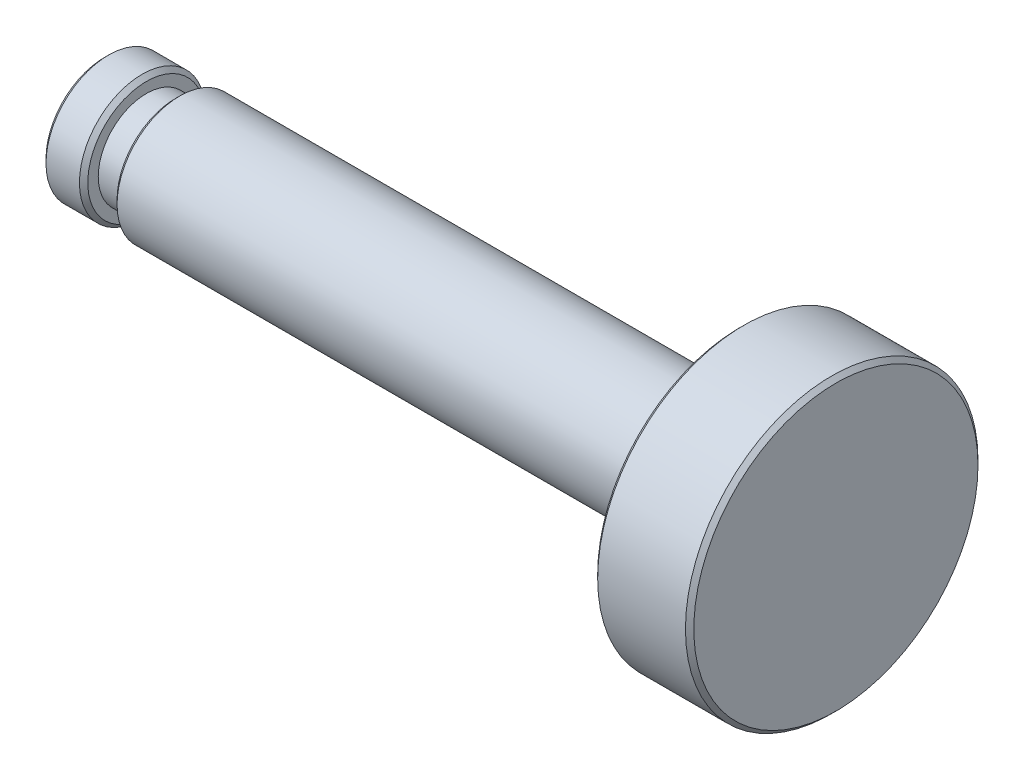
ISO-10303-21;
HEADER;
FILE_DESCRIPTION(('STEP AP214'),'2;1');
FILE_NAME('part.step','',(''),(''),'','','');
FILE_SCHEMA(('AUTOMOTIVE_DESIGN { 1 0 10303 214 1 1 1 1 }'));
ENDSEC;
DATA;
#1=APPLICATION_CONTEXT('core data for automotive mechanical design processes');
#2=APPLICATION_PROTOCOL_DEFINITION('international standard','automotive_design',2000,#1);
#3=PRODUCT_CONTEXT('',#1,'mechanical');
#4=PRODUCT('Part','Part','',(#3));
#5=PRODUCT_RELATED_PRODUCT_CATEGORY('part','',(#4));
#6=PRODUCT_DEFINITION_FORMATION('','',#4);
#7=PRODUCT_DEFINITION_CONTEXT('part definition',#1,'design');
#8=PRODUCT_DEFINITION('design','',#6,#7);
#9=PRODUCT_DEFINITION_SHAPE('','',#8);
#10=(LENGTH_UNIT() NAMED_UNIT(*) SI_UNIT(.MILLI.,.METRE.));
#11=(NAMED_UNIT(*) PLANE_ANGLE_UNIT() SI_UNIT($,.RADIAN.));
#12=(NAMED_UNIT(*) SI_UNIT($,.STERADIAN.) SOLID_ANGLE_UNIT());
#13=UNCERTAINTY_MEASURE_WITH_UNIT(LENGTH_MEASURE(1.E-05),#10,'distance_accuracy_value','');
#14=(GEOMETRIC_REPRESENTATION_CONTEXT(3) GLOBAL_UNCERTAINTY_ASSIGNED_CONTEXT((#13)) GLOBAL_UNIT_ASSIGNED_CONTEXT((#10,
#11,#12)) REPRESENTATION_CONTEXT('',''));
#15=CARTESIAN_POINT('',(0.,0.,0.));
#16=DIRECTION('',(0.,0.,1.));
#17=DIRECTION('',(1.,0.,0.));
#18=AXIS2_PLACEMENT_3D('',#15,#16,#17);
#19=CARTESIAN_POINT('',(-8.75,1.5,0.));
#20=DIRECTION('',(-1.,0.,0.));
#21=DIRECTION('',(0.,0.,1.));
#22=AXIS2_PLACEMENT_3D('',#19,#20,#21);
#23=PLANE('',#22);
#24=CARTESIAN_POINT('',(-8.74999999996362,0.,0.));
#25=DIRECTION('',(1.,0.,0.));
#26=DIRECTION('',(0.,0.,-1.));
#27=AXIS2_PLACEMENT_3D('',#24,#25,#26);
#28=CIRCLE('',#27,1.40000000004648);
#29=CARTESIAN_POINT('',(-8.74999999996362,0.,1.40000000004648));
#30=VERTEX_POINT('',#29);
#31=EDGE_CURVE('E11',#30,#30,#28,.T.);
#32=ORIENTED_EDGE('',*,*,#31,.F.);
#33=EDGE_LOOP('',(#32));
#34=FACE_BOUND('',#33,.T.);
#35=ADVANCED_FACE('F17',(#34),#23,.T.);
#36=CARTESIAN_POINT('',(8.75,3.5,0.));
#37=DIRECTION('',(1.,0.,0.));
#38=DIRECTION('',(0.,1.,0.));
#39=AXIS2_PLACEMENT_3D('',#36,#37,#38);
#40=PLANE('',#39);
#41=CARTESIAN_POINT('',(8.74999999996362,0.,0.));
#42=DIRECTION('',(-1.,0.,0.));
#43=DIRECTION('',(0.,0.,1.));
#44=AXIS2_PLACEMENT_3D('',#41,#42,#43);
#45=CIRCLE('',#44,3.40000000005602);
#46=CARTESIAN_POINT('',(8.74999999996362,0.,-3.40000000005602));
#47=VERTEX_POINT('',#46);
#48=EDGE_CURVE('E88',#47,#47,#45,.T.);
#49=ORIENTED_EDGE('',*,*,#48,.F.);
#50=EDGE_LOOP('',(#49));
#51=FACE_BOUND('',#50,.T.);
#52=ADVANCED_FACE('F384',(#51),#40,.T.);
#53=CARTESIAN_POINT('',(-7.75,1.15,0.));
#54=DIRECTION('',(1.,0.,0.));
#55=DIRECTION('',(0.,1.,0.));
#56=AXIS2_PLACEMENT_3D('',#53,#54,#55);
#57=PLANE('',#56);
#58=CARTESIAN_POINT('',(-7.75,0.,0.));
#59=DIRECTION('',(1.,0.,0.));
#60=DIRECTION('',(0.,0.,-1.));
#61=AXIS2_PLACEMENT_3D('',#58,#59,#60);
#62=CIRCLE('',#61,1.15);
#63=CARTESIAN_POINT('',(-7.75,0.,1.15));
#64=VERTEX_POINT('',#63);
#65=EDGE_CURVE('E139',#64,#64,#62,.T.);
#66=ORIENTED_EDGE('',*,*,#65,.F.);
#67=EDGE_LOOP('',(#66));
#68=FACE_BOUND('',#67,.T.);
#69=CARTESIAN_POINT('',(-7.74999999993042,0.,0.));
#70=DIRECTION('',(1.,0.,0.));
#71=DIRECTION('',(0.,0.,1.));
#72=AXIS2_PLACEMENT_3D('',#69,#70,#71);
#73=CIRCLE('',#72,1.39999999998963);
#74=CARTESIAN_POINT('',(-7.74999999993042,0.,-1.39999999998963));
#75=VERTEX_POINT('',#74);
#76=EDGE_CURVE('E164',#75,#75,#73,.T.);
#77=ORIENTED_EDGE('',*,*,#76,.T.);
#78=EDGE_LOOP('',(#77));
#79=FACE_BOUND('',#78,.T.);
#80=ADVANCED_FACE('F374',(#68,#79),#57,.T.);
#81=CARTESIAN_POINT('',(-7.05,1.5,0.));
#82=DIRECTION('',(-1.,0.,0.));
#83=DIRECTION('',(0.,0.,1.));
#84=AXIS2_PLACEMENT_3D('',#81,#82,#83);
#85=PLANE('',#84);
#86=CARTESIAN_POINT('',(-7.05,0.,0.));
#87=DIRECTION('',(1.,0.,0.));
#88=DIRECTION('',(0.,0.,-1.));
#89=AXIS2_PLACEMENT_3D('',#86,#87,#88);
#90=CIRCLE('',#89,1.15);
#91=CARTESIAN_POINT('',(-7.05,0.,1.15));
#92=VERTEX_POINT('',#91);
#93=EDGE_CURVE('E113',#92,#92,#90,.T.);
#94=ORIENTED_EDGE('',*,*,#93,.T.);
#95=EDGE_LOOP('',(#94));
#96=FACE_BOUND('',#95,.T.);
#97=CARTESIAN_POINT('',(-7.04999999993561,0.,0.));
#98=DIRECTION('',(1.,0.,0.));
#99=DIRECTION('',(0.,0.,-1.));
#100=AXIS2_PLACEMENT_3D('',#97,#98,#99);
#101=CIRCLE('',#100,1.40000000004648);
#102=CARTESIAN_POINT('',(-7.04999999993561,0.,1.40000000004648));
#103=VERTEX_POINT('',#102);
#104=EDGE_CURVE('E151',#103,#103,#101,.T.);
#105=ORIENTED_EDGE('',*,*,#104,.F.);
#106=EDGE_LOOP('',(#105));
#107=FACE_BOUND('',#106,.T.);
#108=ADVANCED_FACE('F364',(#96,#107),#85,.T.);
#109=CARTESIAN_POINT('',(6.45,1.5,0.));
#110=DIRECTION('',(-1.,0.,0.));
#111=DIRECTION('',(0.,0.,1.));
#112=AXIS2_PLACEMENT_3D('',#109,#110,#111);
#113=PLANE('',#112);
#114=CARTESIAN_POINT('',(6.45,0.,0.));
#115=DIRECTION('',(-1.,0.,0.));
#116=DIRECTION('',(0.,0.,-1.));
#117=AXIS2_PLACEMENT_3D('',#114,#115,#116);
#118=CIRCLE('',#117,1.5);
#119=CARTESIAN_POINT('',(6.45,0.,1.5));
#120=VERTEX_POINT('',#119);
#121=EDGE_CURVE('E154',#120,#120,#118,.T.);
#122=ORIENTED_EDGE('',*,*,#121,.F.);
#123=EDGE_LOOP('',(#122));
#124=FACE_BOUND('',#123,.T.);
#125=CARTESIAN_POINT('',(6.45000000002938,0.,0.));
#126=DIRECTION('',(-1.,0.,0.));
#127=DIRECTION('',(0.,0.,-1.));
#128=AXIS2_PLACEMENT_3D('',#125,#126,#127);
#129=CIRCLE('',#128,3.39999999994234);
#130=CARTESIAN_POINT('',(6.45000000002938,0.,3.39999999994234));
#131=VERTEX_POINT('',#130);
#132=EDGE_CURVE('E107',#131,#131,#129,.T.);
#133=ORIENTED_EDGE('',*,*,#132,.T.);
#134=EDGE_LOOP('',(#133));
#135=FACE_BOUND('',#134,.T.);
#136=ADVANCED_FACE('F108',(#124,#135),#113,.T.);
#137=CARTESIAN_POINT('',(-8.65000000010241,0.,0.));
#138=DIRECTION('',(1.,0.,0.));
#139=DIRECTION('',(0.,0.,-1.));
#140=AXIS2_PLACEMENT_3D('',#137,#138,#139);
#141=CONICAL_SURFACE('',#140,1.49999999990769,0.785398163397448);
#142=CARTESIAN_POINT('',(-8.65,0.,0.));
#143=DIRECTION('',(1.,0.,0.));
#144=DIRECTION('',(0.,0.,-1.));
#145=AXIS2_PLACEMENT_3D('',#142,#143,#144);
#146=CIRCLE('',#145,1.5);
#147=CARTESIAN_POINT('',(-8.65,0.,1.5));
#148=VERTEX_POINT('',#147);
#149=EDGE_CURVE('E128',#148,#148,#146,.T.);
#150=ORIENTED_EDGE('',*,*,#149,.F.);
#151=DIRECTION('',(-0.707106781186548,0.,-0.707106781186548));
#152=VECTOR('',#151,1.);
#153=CARTESIAN_POINT('',(-8.65000000010241,0.,1.49999999990769));
#154=LINE('',#153,#152);
#155=EDGE_CURVE('E27',#148,#30,#154,.T.);
#156=ORIENTED_EDGE('',*,*,#155,.T.);
#157=ORIENTED_EDGE('',*,*,#31,.T.);
#158=ORIENTED_EDGE('',*,*,#155,.F.);
#159=EDGE_LOOP('',(#150,#156,#157,#158));
#160=FACE_BOUND('',#159,.T.);
#161=ADVANCED_FACE('F19',(#160),#141,.T.);
#162=CARTESIAN_POINT('',(43.7434951565,0.,0.));
#163=DIRECTION('',(1.,0.,0.));
#164=DIRECTION('',(0.,0.,-1.));
#165=AXIS2_PLACEMENT_3D('',#162,#163,#164);
#166=CYLINDRICAL_SURFACE('',#165,1.5);
#167=CARTESIAN_POINT('',(-7.84999999996217,0.,0.));
#168=DIRECTION('',(1.,0.,0.));
#169=DIRECTION('',(0.,-1.,0.));
#170=AXIS2_PLACEMENT_3D('',#167,#168,#169);
#171=CIRCLE('',#170,1.50000000002137);
#172=CARTESIAN_POINT('',(-7.84999999996217,0.,1.50000000002137));
#173=VERTEX_POINT('',#172);
#174=CARTESIAN_POINT('',(-7.84999999996217,0.,-1.50000000002137));
#175=VERTEX_POINT('',#174);
#176=EDGE_CURVE('E131',#173,#175,#171,.T.);
#177=ORIENTED_EDGE('',*,*,#176,.F.);
#178=DIRECTION('',(-1.,0.,0.));
#179=VECTOR('',#178,1.);
#180=CARTESIAN_POINT('',(43.7434951565,0.,1.5));
#181=LINE('',#180,#179);
#182=EDGE_CURVE('E98',#173,#148,#181,.T.);
#183=ORIENTED_EDGE('',*,*,#182,.T.);
#184=ORIENTED_EDGE('',*,*,#149,.T.);
#185=ORIENTED_EDGE('',*,*,#182,.F.);
#186=CARTESIAN_POINT('',(-7.84999999996217,0.,0.));
#187=DIRECTION('',(1.,0.,0.));
#188=DIRECTION('',(0.,-1.,0.));
#189=AXIS2_PLACEMENT_3D('',#186,#187,#188);
#190=CIRCLE('',#189,1.50000000002137);
#191=EDGE_CURVE('E171',#175,#173,#190,.T.);
#192=ORIENTED_EDGE('',*,*,#191,.F.);
#193=EDGE_LOOP('',(#177,#183,#184,#185,#192));
#194=FACE_BOUND('',#193,.T.);
#195=ADVANCED_FACE('F337',(#194),#166,.T.);
#196=CARTESIAN_POINT('',(-7.84999999984848,0.,0.));
#197=DIRECTION('',(-1.,0.,0.));
#198=DIRECTION('',(0.,0.,1.));
#199=AXIS2_PLACEMENT_3D('',#196,#197,#198);
#200=CONICAL_SURFACE('',#199,1.49999999990769,0.785398163397448);
#201=ORIENTED_EDGE('',*,*,#176,.T.);
#202=DIRECTION('',(0.707106781186548,0.,0.707106781186548));
#203=VECTOR('',#202,1.);
#204=CARTESIAN_POINT('',(-7.84999999984848,0.,-1.49999999990769));
#205=LINE('',#204,#203);
#206=EDGE_CURVE('E135',#175,#75,#205,.T.);
#207=ORIENTED_EDGE('',*,*,#206,.T.);
#208=ORIENTED_EDGE('',*,*,#76,.F.);
#209=ORIENTED_EDGE('',*,*,#206,.F.);
#210=ORIENTED_EDGE('',*,*,#191,.T.);
#211=EDGE_LOOP('',(#201,#207,#208,#209,#210));
#212=FACE_BOUND('',#211,.T.);
#213=ADVANCED_FACE('F327',(#212),#200,.T.);
#214=CARTESIAN_POINT('',(8.65000000004557,0.,0.));
#215=DIRECTION('',(-1.,0.,0.));
#216=DIRECTION('',(0.,0.,1.));
#217=AXIS2_PLACEMENT_3D('',#214,#215,#216);
#218=CONICAL_SURFACE('',#217,3.49999999997408,0.785398163397448);
#219=CARTESIAN_POINT('',(8.65,0.,0.));
#220=DIRECTION('',(-1.,0.,0.));
#221=DIRECTION('',(0.,0.,-1.));
#222=AXIS2_PLACEMENT_3D('',#219,#220,#221);
#223=CIRCLE('',#222,3.5);
#224=CARTESIAN_POINT('',(8.65,0.,-3.50000000001965));
#225=VERTEX_POINT('',#224);
#226=CARTESIAN_POINT('',(8.65,0.,3.5));
#227=VERTEX_POINT('',#226);
#228=EDGE_CURVE('E142',#225,#227,#223,.T.);
#229=ORIENTED_EDGE('',*,*,#228,.F.);
#230=DIRECTION('',(0.707106781186548,0.,0.707106781186548));
#231=VECTOR('',#230,1.);
#232=CARTESIAN_POINT('',(8.65000000004557,0.,-3.49999999997408));
#233=LINE('',#232,#231);
#234=EDGE_CURVE('E158',#225,#47,#233,.T.);
#235=ORIENTED_EDGE('',*,*,#234,.T.);
#236=ORIENTED_EDGE('',*,*,#48,.T.);
#237=ORIENTED_EDGE('',*,*,#234,.F.);
#238=CARTESIAN_POINT('',(8.65,0.,0.));
#239=DIRECTION('',(-1.,0.,0.));
#240=DIRECTION('',(0.,0.,-1.));
#241=AXIS2_PLACEMENT_3D('',#238,#239,#240);
#242=CIRCLE('',#241,3.5);
#243=EDGE_CURVE('E161',#227,#225,#242,.T.);
#244=ORIENTED_EDGE('',*,*,#243,.F.);
#245=EDGE_LOOP('',(#229,#235,#236,#237,#244));
#246=FACE_BOUND('',#245,.T.);
#247=ADVANCED_FACE('F317',(#246),#218,.T.);
#248=CARTESIAN_POINT('',(43.7434951565,0.,0.));
#249=DIRECTION('',(1.,0.,0.));
#250=DIRECTION('',(0.,0.,-1.));
#251=AXIS2_PLACEMENT_3D('',#248,#249,#250);
#252=CYLINDRICAL_SURFACE('',#251,3.5);
#253=ORIENTED_EDGE('',*,*,#228,.T.);
#254=DIRECTION('',(-1.,0.,0.));
#255=VECTOR('',#254,1.);
#256=CARTESIAN_POINT('',(43.7434951565,0.,3.5));
#257=LINE('',#256,#255);
#258=CARTESIAN_POINT('',(6.55000000006112,0.,3.49999999997408));
#259=VERTEX_POINT('',#258);
#260=EDGE_CURVE('E179',#227,#259,#257,.T.);
#261=ORIENTED_EDGE('',*,*,#260,.T.);
#262=CARTESIAN_POINT('',(6.55000000006112,0.,0.));
#263=DIRECTION('',(-1.,0.,0.));
#264=DIRECTION('',(0.,1.,0.));
#265=AXIS2_PLACEMENT_3D('',#262,#263,#264);
#266=CIRCLE('',#265,3.49999999997408);
#267=EDGE_CURVE('E124',#259,#259,#266,.T.);
#268=ORIENTED_EDGE('',*,*,#267,.F.);
#269=ORIENTED_EDGE('',*,*,#260,.F.);
#270=ORIENTED_EDGE('',*,*,#243,.T.);
#271=EDGE_LOOP('',(#253,#261,#268,#269,#270));
#272=FACE_BOUND('',#271,.T.);
#273=ADVANCED_FACE('F307',(#272),#252,.T.);
#274=CARTESIAN_POINT('',(43.7434951565,0.,0.));
#275=DIRECTION('',(1.,0.,0.));
#276=DIRECTION('',(0.,0.,-1.));
#277=AXIS2_PLACEMENT_3D('',#274,#275,#276);
#278=CYLINDRICAL_SURFACE('',#277,1.15);
#279=ORIENTED_EDGE('',*,*,#93,.F.);
#280=DIRECTION('',(-1.,0.,0.));
#281=VECTOR('',#280,1.);
#282=CARTESIAN_POINT('',(43.7434951565,0.,1.15));
#283=LINE('',#282,#281);
#284=EDGE_CURVE('E122',#92,#64,#283,.T.);
#285=ORIENTED_EDGE('',*,*,#284,.T.);
#286=ORIENTED_EDGE('',*,*,#65,.T.);
#287=ORIENTED_EDGE('',*,*,#284,.F.);
#288=EDGE_LOOP('',(#279,#285,#286,#287));
#289=FACE_BOUND('',#288,.T.);
#290=ADVANCED_FACE('F295',(#289),#278,.T.);
#291=CARTESIAN_POINT('',(6.54999999994743,0.,0.));
#292=DIRECTION('',(1.,0.,0.));
#293=DIRECTION('',(0.,0.,-1.));
#294=AXIS2_PLACEMENT_3D('',#291,#292,#293);
#295=CONICAL_SURFACE('',#294,3.49999999986039,0.785398163397448);
#296=ORIENTED_EDGE('',*,*,#267,.T.);
#297=DIRECTION('',(-0.707106781186548,0.,-0.707106781186548));
#298=VECTOR('',#297,1.);
#299=CARTESIAN_POINT('',(6.54999999994743,0.,3.49999999986039));
#300=LINE('',#299,#298);
#301=EDGE_CURVE('E114',#259,#131,#300,.T.);
#302=ORIENTED_EDGE('',*,*,#301,.T.);
#303=ORIENTED_EDGE('',*,*,#132,.F.);
#304=ORIENTED_EDGE('',*,*,#301,.F.);
#305=EDGE_LOOP('',(#296,#302,#303,#304));
#306=FACE_BOUND('',#305,.T.);
#307=ADVANCED_FACE('F283',(#306),#295,.T.);
#308=CARTESIAN_POINT('',(-6.95000000013124,0.,0.));
#309=DIRECTION('',(1.,0.,0.));
#310=DIRECTION('',(0.,0.,-1.));
#311=AXIS2_PLACEMENT_3D('',#308,#309,#310);
#312=CONICAL_SURFACE('',#311,1.49999999990769,0.785398163681665);
#313=CARTESIAN_POINT('',(-6.95,0.,0.));
#314=DIRECTION('',(1.,0.,0.));
#315=DIRECTION('',(0.,0.,-1.));
#316=AXIS2_PLACEMENT_3D('',#313,#314,#315);
#317=CIRCLE('',#316,1.5);
#318=CARTESIAN_POINT('',(-6.95,0.,1.5));
#319=VERTEX_POINT('',#318);
#320=EDGE_CURVE('E143',#319,#319,#317,.T.);
#321=ORIENTED_EDGE('',*,*,#320,.F.);
#322=DIRECTION('',(-0.707106780985576,0.,-0.707106781387519));
#323=VECTOR('',#322,1.);
#324=CARTESIAN_POINT('',(-6.95000000013124,0.,1.49999999990769));
#325=LINE('',#324,#323);
#326=EDGE_CURVE('E21',#319,#103,#325,.T.);
#327=ORIENTED_EDGE('',*,*,#326,.T.);
#328=ORIENTED_EDGE('',*,*,#104,.T.);
#329=ORIENTED_EDGE('',*,*,#326,.F.);
#330=EDGE_LOOP('',(#321,#327,#328,#329));
#331=FACE_BOUND('',#330,.T.);
#332=ADVANCED_FACE('F270',(#331),#312,.T.);
#333=CARTESIAN_POINT('',(43.7434951565,0.,0.));
#334=DIRECTION('',(1.,0.,0.));
#335=DIRECTION('',(0.,0.,-1.));
#336=AXIS2_PLACEMENT_3D('',#333,#334,#335);
#337=CYLINDRICAL_SURFACE('',#336,1.5);
#338=ORIENTED_EDGE('',*,*,#121,.T.);
#339=DIRECTION('',(-1.,0.,0.));
#340=VECTOR('',#339,1.);
#341=CARTESIAN_POINT('',(43.7434951565,0.,1.5));
#342=LINE('',#341,#340);
#343=EDGE_CURVE('E147',#120,#319,#342,.T.);
#344=ORIENTED_EDGE('',*,*,#343,.T.);
#345=ORIENTED_EDGE('',*,*,#320,.T.);
#346=ORIENTED_EDGE('',*,*,#343,.F.);
#347=EDGE_LOOP('',(#338,#344,#345,#346));
#348=FACE_BOUND('',#347,.T.);
#349=ADVANCED_FACE('F264',(#348),#337,.T.);
#350=CLOSED_SHELL('',(#35,#52,#80,#108,#136,#161,#195,#213,#247,#273,#290,#307,#332,#349));
#351=MANIFOLD_SOLID_BREP('B1',#350);
#352=ADVANCED_BREP_SHAPE_REPRESENTATION('',(#18,#351),#14);
#353=SHAPE_DEFINITION_REPRESENTATION(#9,#352);
ENDSEC;
END-ISO-10303-21;
